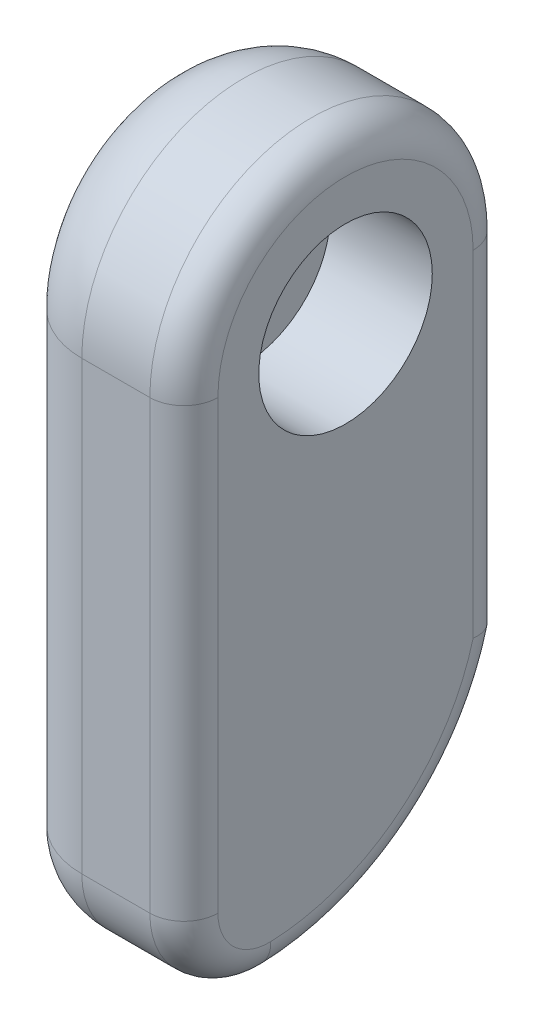
ISO-10303-21;
HEADER;
FILE_DESCRIPTION(('STEP AP214'),'2;1');
FILE_NAME('part.step','',(''),(''),'','','');
FILE_SCHEMA(('AUTOMOTIVE_DESIGN { 1 0 10303 214 1 1 1 1 }'));
ENDSEC;
DATA;
#1=APPLICATION_CONTEXT('core data for automotive mechanical design processes');
#2=APPLICATION_PROTOCOL_DEFINITION('international standard','automotive_design',2000,#1);
#3=PRODUCT_CONTEXT('',#1,'mechanical');
#4=PRODUCT('Part','Part','',(#3));
#5=PRODUCT_RELATED_PRODUCT_CATEGORY('part','',(#4));
#6=PRODUCT_DEFINITION_FORMATION('','',#4);
#7=PRODUCT_DEFINITION_CONTEXT('part definition',#1,'design');
#8=PRODUCT_DEFINITION('design','',#6,#7);
#9=PRODUCT_DEFINITION_SHAPE('','',#8);
#10=(LENGTH_UNIT() NAMED_UNIT(*) SI_UNIT(.MILLI.,.METRE.));
#11=(NAMED_UNIT(*) PLANE_ANGLE_UNIT() SI_UNIT($,.RADIAN.));
#12=(NAMED_UNIT(*) SI_UNIT($,.STERADIAN.) SOLID_ANGLE_UNIT());
#13=UNCERTAINTY_MEASURE_WITH_UNIT(LENGTH_MEASURE(1.E-05),#10,'distance_accuracy_value','');
#14=(GEOMETRIC_REPRESENTATION_CONTEXT(3) GLOBAL_UNCERTAINTY_ASSIGNED_CONTEXT((#13)) GLOBAL_UNIT_ASSIGNED_CONTEXT((#10,
#11,#12)) REPRESENTATION_CONTEXT('',''));
#15=CARTESIAN_POINT('',(0.,0.,0.));
#16=DIRECTION('',(0.,0.,1.));
#17=DIRECTION('',(1.,0.,0.));
#18=AXIS2_PLACEMENT_3D('',#15,#16,#17);
#19=CARTESIAN_POINT('',(-11.,0.,0.));
#20=DIRECTION('',(1.,0.,0.));
#21=DIRECTION('',(0.,0.,-1.));
#22=AXIS2_PLACEMENT_3D('',#19,#20,#21);
#23=CYLINDRICAL_SURFACE('',#22,9.5);
#24=DIRECTION('',(1.,0.,0.));
#25=VECTOR('',#24,1.);
#26=CARTESIAN_POINT('',(-11.,0.,9.5));
#27=LINE('',#26,#25);
#28=CARTESIAN_POINT('',(-6.,0.,9.5));
#29=VERTEX_POINT('',#28);
#30=CARTESIAN_POINT('',(-2.,0.,9.5));
#31=VERTEX_POINT('',#30);
#32=EDGE_CURVE('E246',#29,#31,#27,.T.);
#33=ORIENTED_EDGE('',*,*,#32,.T.);
#34=CARTESIAN_POINT('',(-2.,0.,0.));
#35=DIRECTION('',(1.,0.,0.));
#36=DIRECTION('',(0.,0.,-1.));
#37=AXIS2_PLACEMENT_3D('',#34,#35,#36);
#38=CIRCLE('',#37,9.5);
#39=CARTESIAN_POINT('',(-2.,0.,-9.5));
#40=VERTEX_POINT('',#39);
#41=EDGE_CURVE('E45',#31,#40,#38,.F.);
#42=ORIENTED_EDGE('',*,*,#41,.T.);
#43=DIRECTION('',(1.,0.,0.));
#44=VECTOR('',#43,1.);
#45=CARTESIAN_POINT('',(-11.,0.,-9.5));
#46=LINE('',#45,#44);
#47=CARTESIAN_POINT('',(-6.,0.,-9.5));
#48=VERTEX_POINT('',#47);
#49=EDGE_CURVE('E240',#48,#40,#46,.T.);
#50=ORIENTED_EDGE('',*,*,#49,.F.);
#51=CARTESIAN_POINT('',(-6.,0.,0.));
#52=DIRECTION('',(1.,0.,0.));
#53=DIRECTION('',(0.,0.,-1.));
#54=AXIS2_PLACEMENT_3D('',#51,#52,#53);
#55=CIRCLE('',#54,9.5);
#56=EDGE_CURVE('E140',#48,#29,#55,.T.);
#57=ORIENTED_EDGE('',*,*,#56,.T.);
#58=EDGE_LOOP('',(#33,#42,#50,#57));
#59=FACE_BOUND('',#58,.T.);
#60=ADVANCED_FACE('F36',(#59),#23,.T.);
#61=CARTESIAN_POINT('',(-11.,0.,-9.5));
#62=DIRECTION('',(0.,0.,1.));
#63=DIRECTION('',(0.,-1.,0.));
#64=AXIS2_PLACEMENT_3D('',#61,#62,#63);
#65=PLANE('',#64);
#66=ORIENTED_EDGE('',*,*,#49,.T.);
#67=DIRECTION('',(0.,-1.,0.));
#68=VECTOR('',#67,1.);
#69=CARTESIAN_POINT('',(-2.,-20.,-9.5));
#70=LINE('',#69,#68);
#71=CARTESIAN_POINT('',(-2.,-20.,-9.5));
#72=VERTEX_POINT('',#71);
#73=EDGE_CURVE('E11',#40,#72,#70,.T.);
#74=ORIENTED_EDGE('',*,*,#73,.T.);
#75=DIRECTION('',(1.,0.,0.));
#76=VECTOR('',#75,1.);
#77=CARTESIAN_POINT('',(-11.,-20.,-9.5));
#78=LINE('',#77,#76);
#79=CARTESIAN_POINT('',(-6.,-20.,-9.5));
#80=VERTEX_POINT('',#79);
#81=EDGE_CURVE('E242',#80,#72,#78,.T.);
#82=ORIENTED_EDGE('',*,*,#81,.F.);
#83=DIRECTION('',(0.,-1.,0.));
#84=VECTOR('',#83,1.);
#85=CARTESIAN_POINT('',(-6.,0.,-9.5));
#86=LINE('',#85,#84);
#87=EDGE_CURVE('E120',#80,#48,#86,.F.);
#88=ORIENTED_EDGE('',*,*,#87,.T.);
#89=EDGE_LOOP('',(#66,#74,#82,#88));
#90=FACE_BOUND('',#89,.T.);
#91=ADVANCED_FACE('F239',(#90),#65,.F.);
#92=CARTESIAN_POINT('',(-11.,-16.4820348897092,4.84545440305545));
#93=DIRECTION('',(1.,0.,0.));
#94=DIRECTION('',(0.,0.,-1.));
#95=AXIS2_PLACEMENT_3D('',#92,#93,#94);
#96=CYLINDRICAL_SURFACE('',#95,14.7705159201487);
#97=ORIENTED_EDGE('',*,*,#81,.T.);
#98=CARTESIAN_POINT('',(-2.,-16.4820348897092,4.84545440305545));
#99=DIRECTION('',(1.,0.,0.));
#100=DIRECTION('',(0.,0.,-1.));
#101=AXIS2_PLACEMENT_3D('',#98,#99,#100);
#102=CIRCLE('',#101,14.7705159201487);
#103=CARTESIAN_POINT('',(-2.,-31.2433155752414,4.32321588446366));
#104=VERTEX_POINT('',#103);
#105=EDGE_CURVE('E152',#72,#104,#102,.F.);
#106=ORIENTED_EDGE('',*,*,#105,.T.);
#107=DIRECTION('',(1.,0.,0.));
#108=VECTOR('',#107,1.);
#109=CARTESIAN_POINT('',(-11.,-31.2433155752414,4.32321588446366));
#110=LINE('',#109,#108);
#111=CARTESIAN_POINT('',(-6.,-31.2433155752414,4.32321588446366));
#112=VERTEX_POINT('',#111);
#113=EDGE_CURVE('E133',#104,#112,#110,.F.);
#114=ORIENTED_EDGE('',*,*,#113,.T.);
#115=CARTESIAN_POINT('',(-6.,-16.4820348897092,4.84545440305545));
#116=DIRECTION('',(1.,0.,0.));
#117=DIRECTION('',(0.,0.,-1.));
#118=AXIS2_PLACEMENT_3D('',#115,#116,#117);
#119=CIRCLE('',#118,14.7705159201487);
#120=EDGE_CURVE('E151',#112,#80,#119,.T.);
#121=ORIENTED_EDGE('',*,*,#120,.T.);
#122=EDGE_LOOP('',(#97,#106,#114,#121));
#123=FACE_BOUND('',#122,.T.);
#124=ADVANCED_FACE('F267',(#123),#96,.T.);
#125=CARTESIAN_POINT('',(-11.,0.,9.5));
#126=DIRECTION('',(0.,0.,1.));
#127=DIRECTION('',(1.,0.,0.));
#128=AXIS2_PLACEMENT_3D('',#125,#126,#127);
#129=PLANE('',#128);
#130=DIRECTION('',(-1.,0.,0.));
#131=VECTOR('',#130,1.);
#132=CARTESIAN_POINT('',(0.,-26.2464418149294,9.5));
#133=LINE('',#132,#131);
#134=CARTESIAN_POINT('',(-6.,-26.2464418149294,9.5));
#135=VERTEX_POINT('',#134);
#136=CARTESIAN_POINT('',(-2.,-26.2464418149294,9.5));
#137=VERTEX_POINT('',#136);
#138=EDGE_CURVE('E243',#135,#137,#133,.F.);
#139=ORIENTED_EDGE('',*,*,#138,.T.);
#140=DIRECTION('',(0.,-1.,0.));
#141=VECTOR('',#140,1.);
#142=CARTESIAN_POINT('',(-2.,0.,9.5));
#143=LINE('',#142,#141);
#144=EDGE_CURVE('E60',#137,#31,#143,.F.);
#145=ORIENTED_EDGE('',*,*,#144,.T.);
#146=ORIENTED_EDGE('',*,*,#32,.F.);
#147=DIRECTION('',(0.,-1.,0.));
#148=VECTOR('',#147,1.);
#149=CARTESIAN_POINT('',(-6.,-26.2464418149294,9.5));
#150=LINE('',#149,#148);
#151=EDGE_CURVE('E146',#29,#135,#150,.T.);
#152=ORIENTED_EDGE('',*,*,#151,.T.);
#153=EDGE_LOOP('',(#139,#145,#146,#152));
#154=FACE_BOUND('',#153,.T.);
#155=ADVANCED_FACE('F257',(#154),#129,.T.);
#156=CARTESIAN_POINT('',(-11.,0.,0.));
#157=DIRECTION('',(1.,0.,0.));
#158=DIRECTION('',(0.,0.,-1.));
#159=AXIS2_PLACEMENT_3D('',#156,#157,#158);
#160=PLANE('',#159);
#161=CARTESIAN_POINT('',(-11.,0.,0.));
#162=DIRECTION('',(1.,0.,0.));
#163=DIRECTION('',(0.,0.,-1.));
#164=AXIS2_PLACEMENT_3D('',#161,#162,#163);
#165=CIRCLE('',#164,4.5);
#166=CARTESIAN_POINT('',(-11.,0.,4.5));
#167=VERTEX_POINT('',#166);
#168=CARTESIAN_POINT('',(-11.,0.,-4.5));
#169=VERTEX_POINT('',#168);
#170=EDGE_CURVE('E137',#167,#169,#165,.F.);
#171=ORIENTED_EDGE('',*,*,#170,.T.);
#172=DIRECTION('',(0.,-1.,0.));
#173=VECTOR('',#172,1.);
#174=CARTESIAN_POINT('',(-11.,0.,-4.5));
#175=LINE('',#174,#173);
#176=CARTESIAN_POINT('',(-11.,-19.3325547276143,-4.5));
#177=VERTEX_POINT('',#176);
#178=EDGE_CURVE('E118',#169,#177,#175,.T.);
#179=ORIENTED_EDGE('',*,*,#178,.T.);
#180=CARTESIAN_POINT('',(-11.,-16.4820348897092,4.84545440305545));
#181=DIRECTION('',(1.,0.,0.));
#182=DIRECTION('',(0.,0.,-1.));
#183=AXIS2_PLACEMENT_3D('',#180,#181,#182);
#184=CIRCLE('',#183,9.77051592014871);
#185=CARTESIAN_POINT('',(-11.,-26.2464418149294,4.5));
#186=VERTEX_POINT('',#185);
#187=EDGE_CURVE('E126',#177,#186,#184,.F.);
#188=ORIENTED_EDGE('',*,*,#187,.T.);
#189=DIRECTION('',(0.,-1.,0.));
#190=VECTOR('',#189,1.);
#191=CARTESIAN_POINT('',(-11.,0.,4.5));
#192=LINE('',#191,#190);
#193=EDGE_CURVE('E132',#186,#167,#192,.F.);
#194=ORIENTED_EDGE('',*,*,#193,.T.);
#195=EDGE_LOOP('',(#171,#179,#188,#194));
#196=FACE_BOUND('',#195,.T.);
#197=ADVANCED_FACE('F135',(#196),#160,.F.);
#198=CARTESIAN_POINT('',(0.,0.,0.));
#199=DIRECTION('',(1.,0.,0.));
#200=DIRECTION('',(0.,0.,-1.));
#201=AXIS2_PLACEMENT_3D('',#198,#199,#200);
#202=PLANE('',#201);
#203=CARTESIAN_POINT('',(0.,-26.2464418149294,4.5));
#204=DIRECTION('',(1.,0.,0.));
#205=DIRECTION('',(0.,0.,-1.));
#206=AXIS2_PLACEMENT_3D('',#203,#204,#205);
#207=CIRCLE('',#206,3.);
#208=CARTESIAN_POINT('',(0.,-26.2464418149294,7.5));
#209=VERTEX_POINT('',#208);
#210=CARTESIAN_POINT('',(0.,-29.2445660711166,4.39392953067819));
#211=VERTEX_POINT('',#210);
#212=EDGE_CURVE('E221',#209,#211,#207,.T.);
#213=ORIENTED_EDGE('',*,*,#212,.T.);
#214=CARTESIAN_POINT('',(0.,-16.4820348897092,4.84545440305545));
#215=DIRECTION('',(1.,0.,0.));
#216=DIRECTION('',(0.,0.,-1.));
#217=AXIS2_PLACEMENT_3D('',#214,#215,#216);
#218=CIRCLE('',#217,12.7705159201487);
#219=CARTESIAN_POINT('',(0.,-19.7494241301962,-7.5));
#220=VERTEX_POINT('',#219);
#221=EDGE_CURVE('E218',#211,#220,#218,.T.);
#222=ORIENTED_EDGE('',*,*,#221,.T.);
#223=DIRECTION('',(0.,-1.,0.));
#224=VECTOR('',#223,1.);
#225=CARTESIAN_POINT('',(0.,0.,-7.5));
#226=LINE('',#225,#224);
#227=CARTESIAN_POINT('',(0.,0.,-7.5));
#228=VERTEX_POINT('',#227);
#229=EDGE_CURVE('E225',#220,#228,#226,.F.);
#230=ORIENTED_EDGE('',*,*,#229,.T.);
#231=CARTESIAN_POINT('',(0.,0.,0.));
#232=DIRECTION('',(1.,0.,0.));
#233=DIRECTION('',(0.,0.,-1.));
#234=AXIS2_PLACEMENT_3D('',#231,#232,#233);
#235=CIRCLE('',#234,7.5);
#236=CARTESIAN_POINT('',(0.,0.,7.5));
#237=VERTEX_POINT('',#236);
#238=EDGE_CURVE('E212',#228,#237,#235,.T.);
#239=ORIENTED_EDGE('',*,*,#238,.T.);
#240=DIRECTION('',(0.,-1.,0.));
#241=VECTOR('',#240,1.);
#242=CARTESIAN_POINT('',(0.,0.,7.5));
#243=LINE('',#242,#241);
#244=EDGE_CURVE('E209',#237,#209,#243,.T.);
#245=ORIENTED_EDGE('',*,*,#244,.T.);
#246=EDGE_LOOP('',(#213,#222,#230,#239,#245));
#247=FACE_BOUND('',#246,.T.);
#248=CARTESIAN_POINT('',(0.,0.,0.));
#249=DIRECTION('',(1.,0.,0.));
#250=DIRECTION('',(0.,0.,-1.));
#251=AXIS2_PLACEMENT_3D('',#248,#249,#250);
#252=CIRCLE('',#251,5.1);
#253=CARTESIAN_POINT('',(0.,0.,-5.1));
#254=VERTEX_POINT('',#253);
#255=EDGE_CURVE('E232',#254,#254,#252,.T.);
#256=ORIENTED_EDGE('',*,*,#255,.F.);
#257=EDGE_LOOP('',(#256));
#258=FACE_BOUND('',#257,.T.);
#259=ADVANCED_FACE('F271',(#247,#258),#202,.T.);
#260=CARTESIAN_POINT('',(-11.,-26.2464418149294,4.5));
#261=DIRECTION('',(1.,0.,0.));
#262=DIRECTION('',(0.,0.,-1.));
#263=AXIS2_PLACEMENT_3D('',#260,#261,#262);
#264=CYLINDRICAL_SURFACE('',#263,5.);
#265=ORIENTED_EDGE('',*,*,#113,.F.);
#266=CARTESIAN_POINT('',(-2.,-26.2464418149294,4.5));
#267=DIRECTION('',(1.,0.,0.));
#268=DIRECTION('',(0.,0.,-1.));
#269=AXIS2_PLACEMENT_3D('',#266,#267,#268);
#270=CIRCLE('',#269,5.);
#271=EDGE_CURVE('E214',#104,#137,#270,.F.);
#272=ORIENTED_EDGE('',*,*,#271,.T.);
#273=ORIENTED_EDGE('',*,*,#138,.F.);
#274=CARTESIAN_POINT('',(-6.,-26.2464418149294,4.5));
#275=DIRECTION('',(1.,0.,0.));
#276=DIRECTION('',(0.,0.,-1.));
#277=AXIS2_PLACEMENT_3D('',#274,#275,#276);
#278=CIRCLE('',#277,5.);
#279=EDGE_CURVE('E148',#135,#112,#278,.T.);
#280=ORIENTED_EDGE('',*,*,#279,.T.);
#281=EDGE_LOOP('',(#265,#272,#273,#280));
#282=FACE_BOUND('',#281,.T.);
#283=ADVANCED_FACE('F260',(#282),#264,.T.);
#284=CARTESIAN_POINT('',(-6.,0.,0.));
#285=DIRECTION('',(1.,0.,0.));
#286=DIRECTION('',(0.,0.,-1.));
#287=AXIS2_PLACEMENT_3D('',#284,#285,#286);
#288=CYLINDRICAL_SURFACE('',#287,5.1);
#289=CARTESIAN_POINT('',(-6.,0.,0.));
#290=DIRECTION('',(1.,0.,0.));
#291=DIRECTION('',(0.,0.,-1.));
#292=AXIS2_PLACEMENT_3D('',#289,#290,#291);
#293=CIRCLE('',#292,5.1);
#294=CARTESIAN_POINT('',(-6.,0.,-5.1));
#295=VERTEX_POINT('',#294);
#296=EDGE_CURVE('E251',#295,#295,#293,.T.);
#297=ORIENTED_EDGE('',*,*,#296,.F.);
#298=EDGE_LOOP('',(#297));
#299=FACE_BOUND('',#298,.T.);
#300=ORIENTED_EDGE('',*,*,#255,.T.);
#301=EDGE_LOOP('',(#300));
#302=FACE_BOUND('',#301,.T.);
#303=ADVANCED_FACE('F287',(#299,#302),#288,.F.);
#304=CARTESIAN_POINT('',(-6.,0.,0.));
#305=DIRECTION('',(1.,0.,0.));
#306=DIRECTION('',(0.,0.,-1.));
#307=AXIS2_PLACEMENT_3D('',#304,#305,#306);
#308=PLANE('',#307);
#309=ORIENTED_EDGE('',*,*,#296,.T.);
#310=EDGE_LOOP('',(#309));
#311=FACE_BOUND('',#310,.T.);
#312=ADVANCED_FACE('F176',(#311),#308,.T.);
#313=CARTESIAN_POINT('',(-6.,0.,4.5));
#314=DIRECTION('',(0.,1.,0.));
#315=DIRECTION('',(0.,0.,1.));
#316=AXIS2_PLACEMENT_3D('',#313,#314,#315);
#317=CYLINDRICAL_SURFACE('',#316,5.);
#318=CARTESIAN_POINT('',(-6.,-26.2464418149294,4.5));
#319=DIRECTION('',(0.,-1.,0.));
#320=DIRECTION('',(0.,0.,-1.));
#321=AXIS2_PLACEMENT_3D('',#318,#319,#320);
#322=CIRCLE('',#321,5.);
#323=EDGE_CURVE('E229',#135,#186,#322,.T.);
#324=ORIENTED_EDGE('',*,*,#323,.F.);
#325=ORIENTED_EDGE('',*,*,#151,.F.);
#326=CARTESIAN_POINT('',(-6.,0.,4.5));
#327=DIRECTION('',(0.,1.,0.));
#328=DIRECTION('',(0.,0.,1.));
#329=AXIS2_PLACEMENT_3D('',#326,#327,#328);
#330=CIRCLE('',#329,5.);
#331=EDGE_CURVE('E233',#167,#29,#330,.T.);
#332=ORIENTED_EDGE('',*,*,#331,.F.);
#333=ORIENTED_EDGE('',*,*,#193,.F.);
#334=EDGE_LOOP('',(#324,#325,#332,#333));
#335=FACE_BOUND('',#334,.T.);
#336=ADVANCED_FACE('F172',(#335),#317,.T.);
#337=CARTESIAN_POINT('',(-6.,-26.2464418149294,4.5));
#338=DIRECTION('',(1.,0.,0.));
#339=DIRECTION('',(0.,0.,-1.));
#340=AXIS2_PLACEMENT_3D('',#337,#338,#339);
#341=SPHERICAL_SURFACE('',#340,5.);
#342=ORIENTED_EDGE('',*,*,#279,.F.);
#343=ORIENTED_EDGE('',*,*,#323,.T.);
#344=CARTESIAN_POINT('',(-6.,-26.2464418149294,4.5));
#345=DIRECTION('',(0.,0.0353568231072689,-0.999374752062389));
#346=DIRECTION('',(0.,0.999374752062389,0.0353568231072689));
#347=AXIS2_PLACEMENT_3D('',#344,#345,#346);
#348=CIRCLE('',#347,5.);
#349=EDGE_CURVE('E129',#112,#186,#348,.T.);
#350=ORIENTED_EDGE('',*,*,#349,.F.);
#351=EDGE_LOOP('',(#342,#343,#350));
#352=FACE_BOUND('',#351,.T.);
#353=ADVANCED_FACE('F168',(#352),#341,.T.);
#354=CARTESIAN_POINT('',(-6.,0.,0.));
#355=DIRECTION('',(1.,0.,0.));
#356=DIRECTION('',(0.,0.,-1.));
#357=AXIS2_PLACEMENT_3D('',#354,#355,#356);
#358=DEGENERATE_TOROIDAL_SURFACE('',#357,4.5,5.,.T.);
#359=ORIENTED_EDGE('',*,*,#331,.T.);
#360=ORIENTED_EDGE('',*,*,#56,.F.);
#361=CARTESIAN_POINT('',(-6.,0.,-4.5));
#362=DIRECTION('',(0.,-1.,0.));
#363=DIRECTION('',(0.,0.,-1.));
#364=AXIS2_PLACEMENT_3D('',#361,#362,#363);
#365=CIRCLE('',#364,5.);
#366=EDGE_CURVE('E123',#169,#48,#365,.T.);
#367=ORIENTED_EDGE('',*,*,#366,.F.);
#368=ORIENTED_EDGE('',*,*,#170,.F.);
#369=EDGE_LOOP('',(#359,#360,#367,#368));
#370=FACE_BOUND('',#369,.T.);
#371=ADVANCED_FACE('F165',(#370),#358,.T.);
#372=CARTESIAN_POINT('',(-6.,-16.4820348897092,4.84545440305545));
#373=DIRECTION('',(1.,0.,0.));
#374=DIRECTION('',(0.,0.,-1.));
#375=AXIS2_PLACEMENT_3D('',#372,#373,#374);
#376=TOROIDAL_SURFACE('',#375,9.77051592014871,5.);
#377=ORIENTED_EDGE('',*,*,#349,.T.);
#378=ORIENTED_EDGE('',*,*,#187,.F.);
#379=CARTESIAN_POINT('',(-6.,-20.,-9.5));
#380=CARTESIAN_POINT('',(-6.13984905240967,-20.0000009743414,-9.50001563332093));
#381=CARTESIAN_POINT('',(-6.27969562236397,-19.9992911239125,-9.49413333459555));
#382=CARTESIAN_POINT('',(-6.55838341615019,-19.9964568485365,-9.47068595781129));
#383=CARTESIAN_POINT('',(-6.69722469982336,-19.9943325085007,-9.45312158102305));
#384=CARTESIAN_POINT('',(-6.97279835368981,-19.9886787936766,-9.40644347002848));
#385=CARTESIAN_POINT('',(-7.10953245742432,-19.9851506458006,-9.37733982109453));
#386=CARTESIAN_POINT('',(-7.38004339285614,-19.9767031541906,-9.30780406455638));
#387=CARTESIAN_POINT('',(-7.51382025385538,-19.9717838242477,-9.26737206925381));
#388=CARTESIAN_POINT('',(-7.77750134595693,-19.9605714477668,-9.17546659970884));
#389=CARTESIAN_POINT('',(-7.90740466641545,-19.954278081051,-9.12399055203206));
#390=CARTESIAN_POINT('',(-8.16243649522016,-19.940340021677,-9.01036180166911));
#391=CARTESIAN_POINT('',(-8.28756322821237,-19.9326948324087,-8.94820517556644));
#392=CARTESIAN_POINT('',(-8.53204576258468,-19.916088869561,-8.81372207712547));
#393=CARTESIAN_POINT('',(-8.65140466127732,-19.9071288127367,-8.74140114641268));
#394=CARTESIAN_POINT('',(-8.88363215268343,-19.8879216545282,-8.58706614778511));
#395=CARTESIAN_POINT('',(-8.99649846416467,-19.8776741047494,-8.50504870346036));
#396=CARTESIAN_POINT('',(-9.21519670670692,-19.8559065626869,-8.33171358937892));
#397=CARTESIAN_POINT('',(-9.32100964611771,-19.8443833410402,-8.2403723641804));
#398=CARTESIAN_POINT('',(-9.52454913474745,-19.8201322258898,-8.04923153299558));
#399=CARTESIAN_POINT('',(-9.62227562822697,-19.8074043240836,-7.94943186871533));
#400=CARTESIAN_POINT('',(-9.80901551532835,-19.7807893129491,-7.74204868074687));
#401=CARTESIAN_POINT('',(-9.89802486392761,-19.7669016709516,-7.6344615833432));
#402=CARTESIAN_POINT('',(-10.0666469119993,-19.7380343579999,-7.41235605105923));
#403=CARTESIAN_POINT('',(-10.1462627495925,-19.7230550544614,-7.2978399504253));
#404=CARTESIAN_POINT('',(-10.2961508956448,-19.6919484768803,-7.06179183678038));
#405=CARTESIAN_POINT('',(-10.3663498674773,-19.6758135426759,-6.94021426052854));
#406=CARTESIAN_POINT('',(-10.4962114441801,-19.6425710416803,-6.69174072618262));
#407=CARTESIAN_POINT('',(-10.5558777374262,-19.6254638181547,-6.56484664917989));
#408=CARTESIAN_POINT('',(-10.6642942046845,-19.5903527441749,-6.3066426457675));
#409=CARTESIAN_POINT('',(-10.7130477473506,-19.5723491725177,-6.17533409649595));
#410=CARTESIAN_POINT('',(-10.7993336905184,-19.5355295982977,-5.90924032787243));
#411=CARTESIAN_POINT('',(-10.8368690231654,-19.5167138095011,-5.77445602701316));
#412=CARTESIAN_POINT('',(-10.9113490048885,-19.4718109355925,-5.45590453811118));
#413=CARTESIAN_POINT('',(-10.9437329022134,-19.4454311285462,-5.27109832365513));
#414=CARTESIAN_POINT('',(-10.9875228875486,-19.3916323998757,-4.89943941394402));
#415=CARTESIAN_POINT('',(-10.9989651230044,-19.3642153523126,-4.712590806127));
#416=CARTESIAN_POINT('',(-10.9999776870257,-19.3351282208175,-4.51726401725501));
#417=CARTESIAN_POINT('',(-11.000000042954,-19.333841877594,-4.50863177763074));
#418=CARTESIAN_POINT('',(-11.,-19.3325547276143,-4.5));
#419=B_SPLINE_CURVE_WITH_KNOTS('',3,(#379,#380,#381,#382,#383,#384,#385,#386,#387,#388,#389,
#390,#391,#392,#393,#394,#395,#396,#397,#398,#399,#400,#401,#402,#403,#404,#405,#406,#407,#408,
#409,#410,#411,#412,#413,#414,#415,#416,#417,#418),.UNSPECIFIED.,.F.,.F.,(4,2,2,2,2,2,2,2,2,2,2,
2,2,2,2,2,2,2,2,4),(0.,0.419418140656579,0.838811106075658,1.25783832906509,1.67686139824643,
2.09598221250927,2.51525731754131,2.93430471228028,3.3534984551153,3.77377876177092,
4.19406196515409,4.61453927785385,5.03487572018565,5.45831604975123,5.88160780184561,
6.30476870737424,6.72781891284481,7.29504332066631,7.86128771452659,7.88747033672041),.UNSPECIFIED.);
#420=EDGE_CURVE('E114',#80,#177,#419,.T.);
#421=ORIENTED_EDGE('',*,*,#420,.F.);
#422=ORIENTED_EDGE('',*,*,#120,.F.);
#423=EDGE_LOOP('',(#377,#378,#421,#422));
#424=FACE_BOUND('',#423,.T.);
#425=ADVANCED_FACE('F127',(#424),#376,.T.);
#426=CARTESIAN_POINT('',(-6.,0.,-4.5));
#427=DIRECTION('',(0.,-1.,0.));
#428=DIRECTION('',(0.,0.,-1.));
#429=AXIS2_PLACEMENT_3D('',#426,#427,#428);
#430=CYLINDRICAL_SURFACE('',#429,5.);
#431=ORIENTED_EDGE('',*,*,#366,.T.);
#432=ORIENTED_EDGE('',*,*,#87,.F.);
#433=ORIENTED_EDGE('',*,*,#420,.T.);
#434=ORIENTED_EDGE('',*,*,#178,.F.);
#435=EDGE_LOOP('',(#431,#432,#433,#434));
#436=FACE_BOUND('',#435,.T.);
#437=ADVANCED_FACE('F116',(#436),#430,.T.);
#438=CARTESIAN_POINT('',(-2.,0.,0.));
#439=DIRECTION('',(1.,0.,0.));
#440=DIRECTION('',(0.,0.,-1.));
#441=AXIS2_PLACEMENT_3D('',#438,#439,#440);
#442=TOROIDAL_SURFACE('',#441,7.5,2.);
#443=CARTESIAN_POINT('',(-2.,0.,-7.5));
#444=DIRECTION('',(0.,-1.,0.));
#445=DIRECTION('',(0.,0.,-1.));
#446=AXIS2_PLACEMENT_3D('',#443,#444,#445);
#447=CIRCLE('',#446,2.);
#448=EDGE_CURVE('E197',#40,#228,#447,.T.);
#449=ORIENTED_EDGE('',*,*,#448,.F.);
#450=ORIENTED_EDGE('',*,*,#41,.F.);
#451=CARTESIAN_POINT('',(-2.,0.,7.5));
#452=DIRECTION('',(0.,-1.,0.));
#453=DIRECTION('',(0.,0.,-1.));
#454=AXIS2_PLACEMENT_3D('',#451,#452,#453);
#455=CIRCLE('',#454,2.);
#456=EDGE_CURVE('E40',#237,#31,#455,.T.);
#457=ORIENTED_EDGE('',*,*,#456,.F.);
#458=ORIENTED_EDGE('',*,*,#238,.F.);
#459=EDGE_LOOP('',(#449,#450,#457,#458));
#460=FACE_BOUND('',#459,.T.);
#461=ADVANCED_FACE('F38',(#460),#442,.T.);
#462=CARTESIAN_POINT('',(-2.,0.,7.5));
#463=DIRECTION('',(0.,-1.,0.));
#464=DIRECTION('',(0.,0.,-1.));
#465=AXIS2_PLACEMENT_3D('',#462,#463,#464);
#466=CYLINDRICAL_SURFACE('',#465,2.);
#467=ORIENTED_EDGE('',*,*,#456,.T.);
#468=ORIENTED_EDGE('',*,*,#144,.F.);
#469=CARTESIAN_POINT('',(-2.,-26.2464418149294,7.5));
#470=DIRECTION('',(0.,-1.,0.));
#471=DIRECTION('',(0.,0.,-1.));
#472=AXIS2_PLACEMENT_3D('',#469,#470,#471);
#473=CIRCLE('',#472,2.);
#474=EDGE_CURVE('E194',#209,#137,#473,.T.);
#475=ORIENTED_EDGE('',*,*,#474,.F.);
#476=ORIENTED_EDGE('',*,*,#244,.F.);
#477=EDGE_LOOP('',(#467,#468,#475,#476));
#478=FACE_BOUND('',#477,.T.);
#479=ADVANCED_FACE('F207',(#478),#466,.T.);
#480=CARTESIAN_POINT('',(-2.,0.,-7.5));
#481=DIRECTION('',(0.,1.,0.));
#482=DIRECTION('',(0.,0.,1.));
#483=AXIS2_PLACEMENT_3D('',#480,#481,#482);
#484=CYLINDRICAL_SURFACE('',#483,2.);
#485=ORIENTED_EDGE('',*,*,#448,.T.);
#486=ORIENTED_EDGE('',*,*,#229,.F.);
#487=CARTESIAN_POINT('',(-2.,-20.,-9.5));
#488=CARTESIAN_POINT('',(-1.94403351321131,-19.9999998692437,-9.4999998401804));
#489=CARTESIAN_POINT('',(-1.88809393667562,-19.9997159892798,-9.49764932111157));
#490=CARTESIAN_POINT('',(-1.7766171906193,-19.9985829260516,-9.48827357973139));
#491=CARTESIAN_POINT('',(-1.7210799966069,-19.9977337774907,-9.48124864439526));
#492=CARTESIAN_POINT('',(-1.5557807213813,-19.9943456911905,-9.45323405701502));
#493=CARTESIAN_POINT('',(-1.44712940734423,-19.9909660933135,-9.42530440956982));
#494=CARTESIAN_POINT('',(-1.23610152344126,-19.9820441929528,-9.35174724946352));
#495=CARTESIAN_POINT('',(-1.1337275394252,-19.9765010060457,-9.30611249942533));
#496=CARTESIAN_POINT('',(-0.93812302924231,-19.9633853339329,-9.19849015613985));
#497=CARTESIAN_POINT('',(-0.844890893087915,-19.9558132069276,-9.13650544943435));
#498=CARTESIAN_POINT('',(-0.669891845698764,-19.9387957110317,-8.99777202666331));
#499=CARTESIAN_POINT('',(-0.58816019450334,-19.9293447867228,-8.9209795461811));
#500=CARTESIAN_POINT('',(-0.438713050121679,-19.9088098444392,-8.75493474548722));
#501=CARTESIAN_POINT('',(-0.371002078847005,-19.8977253015612,-8.66567842096252));
#502=CARTESIAN_POINT('',(-0.25103601071386,-19.8741148247134,-8.47660401810469));
#503=CARTESIAN_POINT('',(-0.198894157514333,-19.8615792083156,-8.37671539772258));
#504=CARTESIAN_POINT('',(-0.112147903784393,-19.8354483363295,-8.16976103353045));
#505=CARTESIAN_POINT('',(-0.0775316380785923,-19.821853804862,-8.06270020120454));
#506=CARTESIAN_POINT('',(-0.035459307050107,-19.7987711992459,-7.88208962759086));
#507=CARTESIAN_POINT('',(-0.0227560781019675,-19.7894798628166,-7.80968609264344));
#508=CARTESIAN_POINT('',(-0.00539296077722698,-19.7707062934983,-7.66402266988424));
#509=CARTESIAN_POINT('',(-0.000719666192264619,-19.7612244055758,-7.59076441537873));
#510=CARTESIAN_POINT('',(-2.55620133205286E-05,-19.7509446119986,-7.51168976311033));
#511=CARTESIAN_POINT('',(6.66503906929202E-08,-19.7501844756784,-7.50584465821358));
#512=CARTESIAN_POINT('',(0.,-19.7494241301962,-7.5));
#513=B_SPLINE_CURVE_WITH_KNOTS('',3,(#487,#488,#489,#490,#491,#492,#493,#494,#495,#496,#497,
#498,#499,#500,#501,#502,#503,#504,#505,#506,#507,#508,#509,#510,#511,#512),.UNSPECIFIED.,.F.,
.F.,(4,2,2,2,2,2,2,2,2,2,2,2,4),(0.,0.167795999156532,0.335581697807497,0.670556196284937,
1.00566776798246,1.34072021616767,1.67677852595505,2.01294505211771,2.35150027797985,
2.6898259876031,2.91172661735795,3.13325641630534,3.15093929150277),.UNSPECIFIED.);
#514=EDGE_CURVE('E188',#72,#220,#513,.T.);
#515=ORIENTED_EDGE('',*,*,#514,.F.);
#516=ORIENTED_EDGE('',*,*,#73,.F.);
#517=EDGE_LOOP('',(#485,#486,#515,#516));
#518=FACE_BOUND('',#517,.T.);
#519=ADVANCED_FACE('F184',(#518),#484,.T.);
#520=CARTESIAN_POINT('',(-2.,-26.2464418149294,4.5));
#521=DIRECTION('',(1.,0.,0.));
#522=DIRECTION('',(0.,0.,-1.));
#523=AXIS2_PLACEMENT_3D('',#520,#521,#522);
#524=TOROIDAL_SURFACE('',#523,3.,2.);
#525=ORIENTED_EDGE('',*,*,#474,.T.);
#526=ORIENTED_EDGE('',*,*,#271,.F.);
#527=CARTESIAN_POINT('',(-2.,-29.2445660711166,4.39392953067819));
#528=DIRECTION('',(0.,0.0353568231072688,-0.999374752062389));
#529=DIRECTION('',(0.,0.999374752062389,0.0353568231072688));
#530=AXIS2_PLACEMENT_3D('',#527,#528,#529);
#531=CIRCLE('',#530,2.);
#532=EDGE_CURVE('E195',#211,#104,#531,.T.);
#533=ORIENTED_EDGE('',*,*,#532,.F.);
#534=ORIENTED_EDGE('',*,*,#212,.F.);
#535=EDGE_LOOP('',(#525,#526,#533,#534));
#536=FACE_BOUND('',#535,.T.);
#537=ADVANCED_FACE('F182',(#536),#524,.T.);
#538=CARTESIAN_POINT('',(-2.,-16.4820348897092,4.84545440305545));
#539=DIRECTION('',(1.,0.,0.));
#540=DIRECTION('',(0.,0.,-1.));
#541=AXIS2_PLACEMENT_3D('',#538,#539,#540);
#542=TOROIDAL_SURFACE('',#541,12.7705159201487,2.);
#543=ORIENTED_EDGE('',*,*,#514,.T.);
#544=ORIENTED_EDGE('',*,*,#221,.F.);
#545=ORIENTED_EDGE('',*,*,#532,.T.);
#546=ORIENTED_EDGE('',*,*,#105,.F.);
#547=EDGE_LOOP('',(#543,#544,#545,#546));
#548=FACE_BOUND('',#547,.T.);
#549=ADVANCED_FACE('F178',(#548),#542,.T.);
#550=CLOSED_SHELL('',(#60,#91,#124,#155,#197,#259,#283,#303,#312,#336,#353,#371,#425,#437,#461,
#479,#519,#537,#549));
#551=MANIFOLD_SOLID_BREP('B2',#550);
#552=ADVANCED_BREP_SHAPE_REPRESENTATION('',(#18,#551),#14);
#553=SHAPE_DEFINITION_REPRESENTATION(#9,#552);
ENDSEC;
END-ISO-10303-21;
